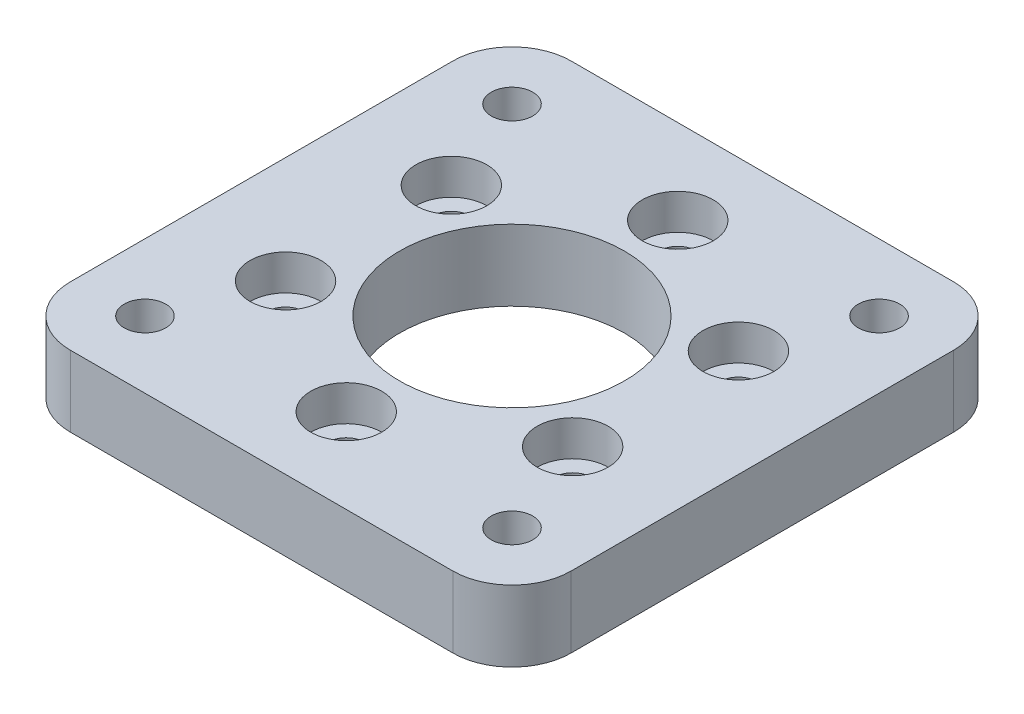
ISO-10303-21;
HEADER;
FILE_DESCRIPTION(('STEP AP214'),'2;1');
FILE_NAME('part.step','',(''),(''),'','','');
FILE_SCHEMA(('AUTOMOTIVE_DESIGN { 1 0 10303 214 1 1 1 1 }'));
ENDSEC;
DATA;
#1=APPLICATION_CONTEXT('core data for automotive mechanical design processes');
#2=APPLICATION_PROTOCOL_DEFINITION('international standard','automotive_design',2000,#1);
#3=PRODUCT_CONTEXT('',#1,'mechanical');
#4=PRODUCT('Part','Part','',(#3));
#5=PRODUCT_RELATED_PRODUCT_CATEGORY('part','',(#4));
#6=PRODUCT_DEFINITION_FORMATION('','',#4);
#7=PRODUCT_DEFINITION_CONTEXT('part definition',#1,'design');
#8=PRODUCT_DEFINITION('design','',#6,#7);
#9=PRODUCT_DEFINITION_SHAPE('','',#8);
#10=(LENGTH_UNIT() NAMED_UNIT(*) SI_UNIT(.MILLI.,.METRE.));
#11=(NAMED_UNIT(*) PLANE_ANGLE_UNIT() SI_UNIT($,.RADIAN.));
#12=(NAMED_UNIT(*) SI_UNIT($,.STERADIAN.) SOLID_ANGLE_UNIT());
#13=UNCERTAINTY_MEASURE_WITH_UNIT(LENGTH_MEASURE(1.E-05),#10,'distance_accuracy_value','');
#14=(GEOMETRIC_REPRESENTATION_CONTEXT(3) GLOBAL_UNCERTAINTY_ASSIGNED_CONTEXT((#13)) GLOBAL_UNIT_ASSIGNED_CONTEXT((#10,
#11,#12)) REPRESENTATION_CONTEXT('',''));
#15=CARTESIAN_POINT('',(0.,0.,0.));
#16=DIRECTION('',(0.,0.,1.));
#17=DIRECTION('',(1.,0.,0.));
#18=AXIS2_PLACEMENT_3D('',#15,#16,#17);
#19=CARTESIAN_POINT('',(-12.1243556529821,-3.,-7.00000000000014));
#20=DIRECTION('',(0.,1.,0.));
#21=DIRECTION('',(0.,0.,1.));
#22=AXIS2_PLACEMENT_3D('',#19,#20,#21);
#23=CYLINDRICAL_SURFACE('',#22,1.55);
#24=CARTESIAN_POINT('',(-12.1243556529821,-3.,-7.00000000000014));
#25=DIRECTION('',(0.,1.,0.));
#26=DIRECTION('',(0.866025403784433,0.,0.50000000000001));
#27=AXIS2_PLACEMENT_3D('',#24,#25,#26);
#28=CIRCLE('',#27,1.55);
#29=CARTESIAN_POINT('',(-10.7820162771162,-3.,-6.22500000000013));
#30=VERTEX_POINT('',#29);
#31=EDGE_CURVE('E167',#30,#30,#28,.T.);
#32=ORIENTED_EDGE('',*,*,#31,.F.);
#33=EDGE_LOOP('',(#32));
#34=FACE_BOUND('',#33,.T.);
#35=CARTESIAN_POINT('',(-12.1243556529821,0.,-7.00000000000014));
#36=DIRECTION('',(0.,1.,0.));
#37=DIRECTION('',(0.,0.,1.));
#38=AXIS2_PLACEMENT_3D('',#35,#36,#37);
#39=CIRCLE('',#38,1.55);
#40=CARTESIAN_POINT('',(-12.1243556529821,0.,-5.45000000000014));
#41=VERTEX_POINT('',#40);
#42=EDGE_CURVE('E39',#41,#41,#39,.F.);
#43=ORIENTED_EDGE('',*,*,#42,.F.);
#44=EDGE_LOOP('',(#43));
#45=FACE_BOUND('',#44,.T.);
#46=ADVANCED_FACE('F35',(#34,#45),#23,.F.);
#47=CARTESIAN_POINT('',(-12.1243556529822,-3.,6.99999999999989));
#48=DIRECTION('',(0.,1.,0.));
#49=DIRECTION('',(0.,0.,1.));
#50=AXIS2_PLACEMENT_3D('',#47,#48,#49);
#51=CYLINDRICAL_SURFACE('',#50,1.55);
#52=CARTESIAN_POINT('',(-12.1243556529822,-3.,6.99999999999989));
#53=DIRECTION('',(0.,1.,0.));
#54=DIRECTION('',(0.866025403784443,0.,-0.499999999999992));
#55=AXIS2_PLACEMENT_3D('',#52,#53,#54);
#56=CIRCLE('',#55,1.55);
#57=CARTESIAN_POINT('',(-10.7820162771163,-3.,6.2249999999999));
#58=VERTEX_POINT('',#57);
#59=EDGE_CURVE('E209',#58,#58,#56,.T.);
#60=ORIENTED_EDGE('',*,*,#59,.F.);
#61=EDGE_LOOP('',(#60));
#62=FACE_BOUND('',#61,.T.);
#63=CARTESIAN_POINT('',(-12.1243556529822,0.,6.99999999999989));
#64=DIRECTION('',(0.,1.,0.));
#65=DIRECTION('',(0.,0.,1.));
#66=AXIS2_PLACEMENT_3D('',#63,#64,#65);
#67=CIRCLE('',#66,1.55);
#68=CARTESIAN_POINT('',(-12.1243556529822,0.,8.54999999999989));
#69=VERTEX_POINT('',#68);
#70=EDGE_CURVE('E178',#69,#69,#67,.F.);
#71=ORIENTED_EDGE('',*,*,#70,.F.);
#72=EDGE_LOOP('',(#71));
#73=FACE_BOUND('',#72,.T.);
#74=ADVANCED_FACE('F286',(#62,#73),#51,.F.);
#75=CARTESIAN_POINT('',(0.,-3.,14.));
#76=DIRECTION('',(0.,1.,0.));
#77=DIRECTION('',(0.,0.,1.));
#78=AXIS2_PLACEMENT_3D('',#75,#76,#77);
#79=CYLINDRICAL_SURFACE('',#78,1.55);
#80=CARTESIAN_POINT('',(0.,-3.,14.));
#81=DIRECTION('',(0.,1.,0.));
#82=DIRECTION('',(0.,0.,-1.));
#83=AXIS2_PLACEMENT_3D('',#80,#81,#82);
#84=CIRCLE('',#83,1.55);
#85=CARTESIAN_POINT('',(0.,-3.,12.45));
#86=VERTEX_POINT('',#85);
#87=EDGE_CURVE('E212',#86,#86,#84,.T.);
#88=ORIENTED_EDGE('',*,*,#87,.F.);
#89=EDGE_LOOP('',(#88));
#90=FACE_BOUND('',#89,.T.);
#91=CARTESIAN_POINT('',(0.,0.,14.));
#92=DIRECTION('',(0.,1.,0.));
#93=DIRECTION('',(0.,0.,1.));
#94=AXIS2_PLACEMENT_3D('',#91,#92,#93);
#95=CIRCLE('',#94,1.55);
#96=CARTESIAN_POINT('',(0.,0.,15.55));
#97=VERTEX_POINT('',#96);
#98=EDGE_CURVE('E174',#97,#97,#95,.F.);
#99=ORIENTED_EDGE('',*,*,#98,.F.);
#100=EDGE_LOOP('',(#99));
#101=FACE_BOUND('',#100,.T.);
#102=ADVANCED_FACE('F292',(#90,#101),#79,.F.);
#103=CARTESIAN_POINT('',(12.1243556529821,-3.,7.00000000000006));
#104=DIRECTION('',(0.,1.,0.));
#105=DIRECTION('',(0.,0.,1.));
#106=AXIS2_PLACEMENT_3D('',#103,#104,#105);
#107=CYLINDRICAL_SURFACE('',#106,1.55);
#108=CARTESIAN_POINT('',(12.1243556529821,-3.,7.00000000000006));
#109=DIRECTION('',(0.,1.,0.));
#110=DIRECTION('',(-0.866025403784436,0.,-0.500000000000004));
#111=AXIS2_PLACEMENT_3D('',#108,#109,#110);
#112=CIRCLE('',#111,1.55);
#113=CARTESIAN_POINT('',(10.7820162771162,-3.,6.22500000000005));
#114=VERTEX_POINT('',#113);
#115=EDGE_CURVE('E215',#114,#114,#112,.T.);
#116=ORIENTED_EDGE('',*,*,#115,.F.);
#117=EDGE_LOOP('',(#116));
#118=FACE_BOUND('',#117,.T.);
#119=CARTESIAN_POINT('',(12.1243556529821,0.,7.00000000000006));
#120=DIRECTION('',(0.,1.,0.));
#121=DIRECTION('',(0.,0.,1.));
#122=AXIS2_PLACEMENT_3D('',#119,#120,#121);
#123=CIRCLE('',#122,1.55);
#124=CARTESIAN_POINT('',(12.1243556529821,0.,8.55000000000006));
#125=VERTEX_POINT('',#124);
#126=EDGE_CURVE('E169',#125,#125,#123,.F.);
#127=ORIENTED_EDGE('',*,*,#126,.F.);
#128=EDGE_LOOP('',(#127));
#129=FACE_BOUND('',#128,.T.);
#130=ADVANCED_FACE('F303',(#118,#129),#107,.F.);
#131=CARTESIAN_POINT('',(12.1243556529822,-3.,-6.99999999999997));
#132=DIRECTION('',(0.,1.,0.));
#133=DIRECTION('',(0.,0.,1.));
#134=AXIS2_PLACEMENT_3D('',#131,#132,#133);
#135=CYLINDRICAL_SURFACE('',#134,1.55);
#136=CARTESIAN_POINT('',(12.1243556529822,-3.,-6.99999999999997));
#137=DIRECTION('',(0.,1.,0.));
#138=DIRECTION('',(-0.86602540378444,0.,0.499999999999998));
#139=AXIS2_PLACEMENT_3D('',#136,#137,#138);
#140=CIRCLE('',#139,1.55);
#141=CARTESIAN_POINT('',(10.7820162771163,-3.,-6.22499999999998));
#142=VERTEX_POINT('',#141);
#143=EDGE_CURVE('E218',#142,#142,#140,.T.);
#144=ORIENTED_EDGE('',*,*,#143,.F.);
#145=EDGE_LOOP('',(#144));
#146=FACE_BOUND('',#145,.T.);
#147=CARTESIAN_POINT('',(12.1243556529822,0.,-6.99999999999997));
#148=DIRECTION('',(0.,1.,0.));
#149=DIRECTION('',(0.,0.,1.));
#150=AXIS2_PLACEMENT_3D('',#147,#148,#149);
#151=CIRCLE('',#150,1.55);
#152=CARTESIAN_POINT('',(12.1243556529822,0.,-5.44999999999997));
#153=VERTEX_POINT('',#152);
#154=EDGE_CURVE('E164',#153,#153,#151,.F.);
#155=ORIENTED_EDGE('',*,*,#154,.F.);
#156=EDGE_LOOP('',(#155));
#157=FACE_BOUND('',#156,.T.);
#158=ADVANCED_FACE('F307',(#146,#157),#135,.F.);
#159=CARTESIAN_POINT('',(0.,-3.,-14.));
#160=DIRECTION('',(0.,1.,0.));
#161=DIRECTION('',(0.,0.,1.));
#162=AXIS2_PLACEMENT_3D('',#159,#160,#161);
#163=CYLINDRICAL_SURFACE('',#162,1.55);
#164=CARTESIAN_POINT('',(0.,-3.,-14.));
#165=DIRECTION('',(0.,1.,0.));
#166=DIRECTION('',(0.,0.,1.));
#167=AXIS2_PLACEMENT_3D('',#164,#165,#166);
#168=CIRCLE('',#167,1.55);
#169=CARTESIAN_POINT('',(0.,-3.,-12.45));
#170=VERTEX_POINT('',#169);
#171=EDGE_CURVE('E162',#170,#170,#168,.T.);
#172=ORIENTED_EDGE('',*,*,#171,.F.);
#173=EDGE_LOOP('',(#172));
#174=FACE_BOUND('',#173,.T.);
#175=CARTESIAN_POINT('',(0.,0.,-14.));
#176=DIRECTION('',(0.,1.,0.));
#177=DIRECTION('',(0.,0.,1.));
#178=AXIS2_PLACEMENT_3D('',#175,#176,#177);
#179=CIRCLE('',#178,1.55);
#180=CARTESIAN_POINT('',(0.,0.,-12.45));
#181=VERTEX_POINT('',#180);
#182=EDGE_CURVE('E159',#181,#181,#179,.F.);
#183=ORIENTED_EDGE('',*,*,#182,.F.);
#184=EDGE_LOOP('',(#183));
#185=FACE_BOUND('',#184,.T.);
#186=ADVANCED_FACE('F311',(#174,#185),#163,.F.);
#187=CARTESIAN_POINT('',(21.15,3.,-21.15));
#188=DIRECTION('',(-1.,0.,0.));
#189=DIRECTION('',(0.,0.,1.));
#190=AXIS2_PLACEMENT_3D('',#187,#188,#189);
#191=PLANE('',#190);
#192=DIRECTION('',(0.,0.,-1.));
#193=VECTOR('',#192,1.);
#194=CARTESIAN_POINT('',(21.15,-3.,-21.15));
#195=LINE('',#194,#193);
#196=CARTESIAN_POINT('',(21.15,-3.,16.15));
#197=VERTEX_POINT('',#196);
#198=CARTESIAN_POINT('',(21.15,-3.,-16.15));
#199=VERTEX_POINT('',#198);
#200=EDGE_CURVE('E256',#197,#199,#195,.T.);
#201=ORIENTED_EDGE('',*,*,#200,.T.);
#202=DIRECTION('',(0.,-1.,0.));
#203=VECTOR('',#202,1.);
#204=CARTESIAN_POINT('',(21.15,3.,-16.15));
#205=LINE('',#204,#203);
#206=CARTESIAN_POINT('',(21.15,3.,-16.15));
#207=VERTEX_POINT('',#206);
#208=EDGE_CURVE('E11',#199,#207,#205,.F.);
#209=ORIENTED_EDGE('',*,*,#208,.T.);
#210=DIRECTION('',(0.,0.,-1.));
#211=VECTOR('',#210,1.);
#212=CARTESIAN_POINT('',(21.15,3.,-21.15));
#213=LINE('',#212,#211);
#214=CARTESIAN_POINT('',(21.15,3.,16.15));
#215=VERTEX_POINT('',#214);
#216=EDGE_CURVE('E129',#215,#207,#213,.T.);
#217=ORIENTED_EDGE('',*,*,#216,.F.);
#218=DIRECTION('',(0.,-1.,0.));
#219=VECTOR('',#218,1.);
#220=CARTESIAN_POINT('',(21.15,3.,16.15));
#221=LINE('',#220,#219);
#222=EDGE_CURVE('E44',#215,#197,#221,.T.);
#223=ORIENTED_EDGE('',*,*,#222,.T.);
#224=EDGE_LOOP('',(#201,#209,#217,#223));
#225=FACE_BOUND('',#224,.T.);
#226=ADVANCED_FACE('F283',(#225),#191,.F.);
#227=CARTESIAN_POINT('',(-21.15,3.,-21.15));
#228=DIRECTION('',(0.,0.,1.));
#229=DIRECTION('',(1.,0.,0.));
#230=AXIS2_PLACEMENT_3D('',#227,#228,#229);
#231=PLANE('',#230);
#232=DIRECTION('',(-1.,0.,0.));
#233=VECTOR('',#232,1.);
#234=CARTESIAN_POINT('',(-21.15,-3.,-21.15));
#235=LINE('',#234,#233);
#236=CARTESIAN_POINT('',(16.15,-3.,-21.15));
#237=VERTEX_POINT('',#236);
#238=CARTESIAN_POINT('',(-16.15,-3.,-21.15));
#239=VERTEX_POINT('',#238);
#240=EDGE_CURVE('E134',#237,#239,#235,.T.);
#241=ORIENTED_EDGE('',*,*,#240,.T.);
#242=DIRECTION('',(0.,-1.,0.));
#243=VECTOR('',#242,1.);
#244=CARTESIAN_POINT('',(-16.15,3.,-21.15));
#245=LINE('',#244,#243);
#246=CARTESIAN_POINT('',(-16.15,3.,-21.15));
#247=VERTEX_POINT('',#246);
#248=EDGE_CURVE('E52',#239,#247,#245,.F.);
#249=ORIENTED_EDGE('',*,*,#248,.T.);
#250=DIRECTION('',(-1.,0.,0.));
#251=VECTOR('',#250,1.);
#252=CARTESIAN_POINT('',(-21.15,3.,-21.15));
#253=LINE('',#252,#251);
#254=CARTESIAN_POINT('',(16.15,3.,-21.15));
#255=VERTEX_POINT('',#254);
#256=EDGE_CURVE('E132',#255,#247,#253,.T.);
#257=ORIENTED_EDGE('',*,*,#256,.F.);
#258=DIRECTION('',(0.,-1.,0.));
#259=VECTOR('',#258,1.);
#260=CARTESIAN_POINT('',(16.15,3.,-21.15));
#261=LINE('',#260,#259);
#262=EDGE_CURVE('E153',#255,#237,#261,.T.);
#263=ORIENTED_EDGE('',*,*,#262,.T.);
#264=EDGE_LOOP('',(#241,#249,#257,#263));
#265=FACE_BOUND('',#264,.T.);
#266=ADVANCED_FACE('F266',(#265),#231,.F.);
#267=CARTESIAN_POINT('',(-21.15,3.,-21.15));
#268=DIRECTION('',(1.,0.,0.));
#269=DIRECTION('',(0.,0.,-1.));
#270=AXIS2_PLACEMENT_3D('',#267,#268,#269);
#271=PLANE('',#270);
#272=DIRECTION('',(0.,0.,1.));
#273=VECTOR('',#272,1.);
#274=CARTESIAN_POINT('',(-21.15,-3.,-21.15));
#275=LINE('',#274,#273);
#276=CARTESIAN_POINT('',(-21.15,-3.,-16.15));
#277=VERTEX_POINT('',#276);
#278=CARTESIAN_POINT('',(-21.15,-3.,16.15));
#279=VERTEX_POINT('',#278);
#280=EDGE_CURVE('E130',#277,#279,#275,.T.);
#281=ORIENTED_EDGE('',*,*,#280,.T.);
#282=DIRECTION('',(0.,-1.,0.));
#283=VECTOR('',#282,1.);
#284=CARTESIAN_POINT('',(-21.15,3.,16.15));
#285=LINE('',#284,#283);
#286=CARTESIAN_POINT('',(-21.15,3.,16.15));
#287=VERTEX_POINT('',#286);
#288=EDGE_CURVE('E108',#279,#287,#285,.F.);
#289=ORIENTED_EDGE('',*,*,#288,.T.);
#290=DIRECTION('',(0.,0.,1.));
#291=VECTOR('',#290,1.);
#292=CARTESIAN_POINT('',(-21.15,3.,-21.15));
#293=LINE('',#292,#291);
#294=CARTESIAN_POINT('',(-21.15,3.,-16.15));
#295=VERTEX_POINT('',#294);
#296=EDGE_CURVE('E260',#295,#287,#293,.T.);
#297=ORIENTED_EDGE('',*,*,#296,.F.);
#298=DIRECTION('',(0.,-1.,0.));
#299=VECTOR('',#298,1.);
#300=CARTESIAN_POINT('',(-21.15,3.,-16.15));
#301=LINE('',#300,#299);
#302=EDGE_CURVE('E113',#295,#277,#301,.T.);
#303=ORIENTED_EDGE('',*,*,#302,.T.);
#304=EDGE_LOOP('',(#281,#289,#297,#303));
#305=FACE_BOUND('',#304,.T.);
#306=ADVANCED_FACE('F275',(#305),#271,.F.);
#307=CARTESIAN_POINT('',(-21.15,3.,21.15));
#308=DIRECTION('',(0.,0.,-1.));
#309=DIRECTION('',(-1.,0.,0.));
#310=AXIS2_PLACEMENT_3D('',#307,#308,#309);
#311=PLANE('',#310);
#312=DIRECTION('',(1.,0.,0.));
#313=VECTOR('',#312,1.);
#314=CARTESIAN_POINT('',(-21.15,3.,21.15));
#315=LINE('',#314,#313);
#316=CARTESIAN_POINT('',(-16.15,3.,21.15));
#317=VERTEX_POINT('',#316);
#318=CARTESIAN_POINT('',(16.15,3.,21.15));
#319=VERTEX_POINT('',#318);
#320=EDGE_CURVE('E123',#317,#319,#315,.T.);
#321=ORIENTED_EDGE('',*,*,#320,.F.);
#322=DIRECTION('',(0.,-1.,0.));
#323=VECTOR('',#322,1.);
#324=CARTESIAN_POINT('',(-16.15,3.,21.15));
#325=LINE('',#324,#323);
#326=CARTESIAN_POINT('',(-16.15,-3.,21.15));
#327=VERTEX_POINT('',#326);
#328=EDGE_CURVE('E107',#317,#327,#325,.T.);
#329=ORIENTED_EDGE('',*,*,#328,.T.);
#330=DIRECTION('',(1.,0.,0.));
#331=VECTOR('',#330,1.);
#332=CARTESIAN_POINT('',(-21.15,-3.,21.15));
#333=LINE('',#332,#331);
#334=CARTESIAN_POINT('',(16.15,-3.,21.15));
#335=VERTEX_POINT('',#334);
#336=EDGE_CURVE('E120',#327,#335,#333,.T.);
#337=ORIENTED_EDGE('',*,*,#336,.T.);
#338=DIRECTION('',(0.,-1.,0.));
#339=VECTOR('',#338,1.);
#340=CARTESIAN_POINT('',(16.15,3.,21.15));
#341=LINE('',#340,#339);
#342=EDGE_CURVE('E125',#335,#319,#341,.F.);
#343=ORIENTED_EDGE('',*,*,#342,.T.);
#344=EDGE_LOOP('',(#321,#329,#337,#343));
#345=FACE_BOUND('',#344,.T.);
#346=ADVANCED_FACE('F119',(#345),#311,.F.);
#347=CARTESIAN_POINT('',(0.,3.,0.));
#348=DIRECTION('',(0.,1.,0.));
#349=DIRECTION('',(0.,0.,1.));
#350=AXIS2_PLACEMENT_3D('',#347,#348,#349);
#351=PLANE('',#350);
#352=CARTESIAN_POINT('',(-12.1243556529821,3.,-7.00000000000014));
#353=DIRECTION('',(0.,1.,0.));
#354=DIRECTION('',(0.866025403784433,0.,0.50000000000001));
#355=AXIS2_PLACEMENT_3D('',#352,#353,#354);
#356=CIRCLE('',#355,3.);
#357=CARTESIAN_POINT('',(-9.52627944162876,3.,-5.50000000000011));
#358=VERTEX_POINT('',#357);
#359=EDGE_CURVE('E194',#358,#358,#356,.T.);
#360=ORIENTED_EDGE('',*,*,#359,.F.);
#361=EDGE_LOOP('',(#360));
#362=FACE_BOUND('',#361,.T.);
#363=CARTESIAN_POINT('',(-12.1243556529822,3.,6.99999999999989));
#364=DIRECTION('',(0.,1.,0.));
#365=DIRECTION('',(0.866025403784443,0.,-0.499999999999992));
#366=AXIS2_PLACEMENT_3D('',#363,#364,#365);
#367=CIRCLE('',#366,3.);
#368=CARTESIAN_POINT('',(-9.52627944162888,3.,5.49999999999991));
#369=VERTEX_POINT('',#368);
#370=EDGE_CURVE('E187',#369,#369,#367,.T.);
#371=ORIENTED_EDGE('',*,*,#370,.F.);
#372=EDGE_LOOP('',(#371));
#373=FACE_BOUND('',#372,.T.);
#374=CARTESIAN_POINT('',(0.,3.,14.));
#375=DIRECTION('',(0.,1.,0.));
#376=DIRECTION('',(0.,0.,-1.));
#377=AXIS2_PLACEMENT_3D('',#374,#375,#376);
#378=CIRCLE('',#377,3.);
#379=CARTESIAN_POINT('',(0.,3.,11.));
#380=VERTEX_POINT('',#379);
#381=EDGE_CURVE('E180',#380,#380,#378,.T.);
#382=ORIENTED_EDGE('',*,*,#381,.F.);
#383=EDGE_LOOP('',(#382));
#384=FACE_BOUND('',#383,.T.);
#385=CARTESIAN_POINT('',(12.1243556529821,3.,7.00000000000006));
#386=DIRECTION('',(0.,1.,0.));
#387=DIRECTION('',(-0.866025403784436,0.,-0.500000000000004));
#388=AXIS2_PLACEMENT_3D('',#385,#386,#387);
#389=CIRCLE('',#388,3.);
#390=CARTESIAN_POINT('',(9.5262794416288,3.,5.50000000000004));
#391=VERTEX_POINT('',#390);
#392=EDGE_CURVE('E176',#391,#391,#389,.T.);
#393=ORIENTED_EDGE('',*,*,#392,.F.);
#394=EDGE_LOOP('',(#393));
#395=FACE_BOUND('',#394,.T.);
#396=CARTESIAN_POINT('',(12.1243556529822,3.,-6.99999999999997));
#397=DIRECTION('',(0.,1.,0.));
#398=DIRECTION('',(-0.86602540378444,0.,0.499999999999998));
#399=AXIS2_PLACEMENT_3D('',#396,#397,#398);
#400=CIRCLE('',#399,3.);
#401=CARTESIAN_POINT('',(9.52627944162884,3.,-5.49999999999998));
#402=VERTEX_POINT('',#401);
#403=EDGE_CURVE('E172',#402,#402,#400,.T.);
#404=ORIENTED_EDGE('',*,*,#403,.F.);
#405=EDGE_LOOP('',(#404));
#406=FACE_BOUND('',#405,.T.);
#407=CARTESIAN_POINT('',(0.,3.,-14.));
#408=DIRECTION('',(0.,1.,0.));
#409=DIRECTION('',(0.,0.,1.));
#410=AXIS2_PLACEMENT_3D('',#407,#408,#409);
#411=CIRCLE('',#410,3.);
#412=CARTESIAN_POINT('',(0.,3.,-11.));
#413=VERTEX_POINT('',#412);
#414=EDGE_CURVE('E221',#413,#413,#411,.T.);
#415=ORIENTED_EDGE('',*,*,#414,.F.);
#416=EDGE_LOOP('',(#415));
#417=FACE_BOUND('',#416,.T.);
#418=CARTESIAN_POINT('',(0.,3.,0.));
#419=DIRECTION('',(0.,-1.,0.));
#420=DIRECTION('',(0.,0.,-1.));
#421=AXIS2_PLACEMENT_3D('',#418,#419,#420);
#422=CIRCLE('',#421,9.5);
#423=CARTESIAN_POINT('',(0.,3.,-9.5));
#424=VERTEX_POINT('',#423);
#425=EDGE_CURVE('E229',#424,#424,#422,.T.);
#426=ORIENTED_EDGE('',*,*,#425,.T.);
#427=EDGE_LOOP('',(#426));
#428=FACE_BOUND('',#427,.T.);
#429=CARTESIAN_POINT('',(-15.5,3.,-15.5));
#430=DIRECTION('',(0.,-1.,0.));
#431=DIRECTION('',(0.,0.,-1.));
#432=AXIS2_PLACEMENT_3D('',#429,#430,#431);
#433=CIRCLE('',#432,1.75);
#434=CARTESIAN_POINT('',(-15.5,3.,-17.25));
#435=VERTEX_POINT('',#434);
#436=EDGE_CURVE('E235',#435,#435,#433,.T.);
#437=ORIENTED_EDGE('',*,*,#436,.T.);
#438=EDGE_LOOP('',(#437));
#439=FACE_BOUND('',#438,.T.);
#440=CARTESIAN_POINT('',(15.5,3.,-15.5));
#441=DIRECTION('',(0.,-1.,0.));
#442=DIRECTION('',(0.,0.,-1.));
#443=AXIS2_PLACEMENT_3D('',#440,#441,#442);
#444=CIRCLE('',#443,1.75);
#445=CARTESIAN_POINT('',(15.5,3.,-17.25));
#446=VERTEX_POINT('',#445);
#447=EDGE_CURVE('E241',#446,#446,#444,.T.);
#448=ORIENTED_EDGE('',*,*,#447,.T.);
#449=EDGE_LOOP('',(#448));
#450=FACE_BOUND('',#449,.T.);
#451=CARTESIAN_POINT('',(15.5,3.,15.5));
#452=DIRECTION('',(0.,-1.,0.));
#453=DIRECTION('',(0.,0.,-1.));
#454=AXIS2_PLACEMENT_3D('',#451,#452,#453);
#455=CIRCLE('',#454,1.75);
#456=CARTESIAN_POINT('',(15.5,3.,13.75));
#457=VERTEX_POINT('',#456);
#458=EDGE_CURVE('E247',#457,#457,#455,.T.);
#459=ORIENTED_EDGE('',*,*,#458,.T.);
#460=EDGE_LOOP('',(#459));
#461=FACE_BOUND('',#460,.T.);
#462=CARTESIAN_POINT('',(-15.5,3.,15.5));
#463=DIRECTION('',(0.,-1.,0.));
#464=DIRECTION('',(0.,0.,-1.));
#465=AXIS2_PLACEMENT_3D('',#462,#463,#464);
#466=CIRCLE('',#465,1.75);
#467=CARTESIAN_POINT('',(-15.5,3.,13.75));
#468=VERTEX_POINT('',#467);
#469=EDGE_CURVE('E253',#468,#468,#466,.T.);
#470=ORIENTED_EDGE('',*,*,#469,.T.);
#471=EDGE_LOOP('',(#470));
#472=FACE_BOUND('',#471,.T.);
#473=ORIENTED_EDGE('',*,*,#296,.T.);
#474=CARTESIAN_POINT('',(-16.15,3.,16.15));
#475=DIRECTION('',(0.,1.,0.));
#476=DIRECTION('',(0.,0.,1.));
#477=AXIS2_PLACEMENT_3D('',#474,#475,#476);
#478=CIRCLE('',#477,5.);
#479=EDGE_CURVE('E151',#287,#317,#478,.T.);
#480=ORIENTED_EDGE('',*,*,#479,.T.);
#481=ORIENTED_EDGE('',*,*,#320,.T.);
#482=CARTESIAN_POINT('',(16.15,3.,16.15));
#483=DIRECTION('',(0.,1.,0.));
#484=DIRECTION('',(0.,0.,1.));
#485=AXIS2_PLACEMENT_3D('',#482,#483,#484);
#486=CIRCLE('',#485,5.);
#487=EDGE_CURVE('E146',#319,#215,#486,.T.);
#488=ORIENTED_EDGE('',*,*,#487,.T.);
#489=ORIENTED_EDGE('',*,*,#216,.T.);
#490=CARTESIAN_POINT('',(16.15,3.,-16.15));
#491=DIRECTION('',(0.,1.,0.));
#492=DIRECTION('',(0.,0.,1.));
#493=AXIS2_PLACEMENT_3D('',#490,#491,#492);
#494=CIRCLE('',#493,5.);
#495=EDGE_CURVE('E59',#207,#255,#494,.T.);
#496=ORIENTED_EDGE('',*,*,#495,.T.);
#497=ORIENTED_EDGE('',*,*,#256,.T.);
#498=CARTESIAN_POINT('',(-16.15,3.,-16.15));
#499=DIRECTION('',(0.,1.,0.));
#500=DIRECTION('',(0.,0.,1.));
#501=AXIS2_PLACEMENT_3D('',#498,#499,#500);
#502=CIRCLE('',#501,5.);
#503=EDGE_CURVE('E149',#247,#295,#502,.T.);
#504=ORIENTED_EDGE('',*,*,#503,.T.);
#505=EDGE_LOOP('',(#473,#480,#481,#488,#489,#496,#497,#504));
#506=FACE_BOUND('',#505,.T.);
#507=ADVANCED_FACE('F273',(#362,#373,#384,#395,#406,#417,#428,#439,#450,#461,#472,#506),#351,.T.);
#508=CARTESIAN_POINT('',(0.,-3.,0.));
#509=DIRECTION('',(0.,1.,0.));
#510=DIRECTION('',(0.,0.,1.));
#511=AXIS2_PLACEMENT_3D('',#508,#509,#510);
#512=PLANE('',#511);
#513=ORIENTED_EDGE('',*,*,#31,.T.);
#514=EDGE_LOOP('',(#513));
#515=FACE_BOUND('',#514,.T.);
#516=ORIENTED_EDGE('',*,*,#59,.T.);
#517=EDGE_LOOP('',(#516));
#518=FACE_BOUND('',#517,.T.);
#519=ORIENTED_EDGE('',*,*,#87,.T.);
#520=EDGE_LOOP('',(#519));
#521=FACE_BOUND('',#520,.T.);
#522=ORIENTED_EDGE('',*,*,#115,.T.);
#523=EDGE_LOOP('',(#522));
#524=FACE_BOUND('',#523,.T.);
#525=ORIENTED_EDGE('',*,*,#143,.T.);
#526=EDGE_LOOP('',(#525));
#527=FACE_BOUND('',#526,.T.);
#528=ORIENTED_EDGE('',*,*,#171,.T.);
#529=EDGE_LOOP('',(#528));
#530=FACE_BOUND('',#529,.T.);
#531=CARTESIAN_POINT('',(0.,-3.,0.));
#532=DIRECTION('',(0.,-1.,0.));
#533=DIRECTION('',(0.,0.,-1.));
#534=AXIS2_PLACEMENT_3D('',#531,#532,#533);
#535=CIRCLE('',#534,9.5);
#536=CARTESIAN_POINT('',(0.,-3.,-9.5));
#537=VERTEX_POINT('',#536);
#538=EDGE_CURVE('E228',#537,#537,#535,.T.);
#539=ORIENTED_EDGE('',*,*,#538,.F.);
#540=EDGE_LOOP('',(#539));
#541=FACE_BOUND('',#540,.T.);
#542=CARTESIAN_POINT('',(-15.5,-3.,-15.5));
#543=DIRECTION('',(0.,-1.,0.));
#544=DIRECTION('',(0.,0.,-1.));
#545=AXIS2_PLACEMENT_3D('',#542,#543,#544);
#546=CIRCLE('',#545,1.75);
#547=CARTESIAN_POINT('',(-15.5,-3.,-17.25));
#548=VERTEX_POINT('',#547);
#549=EDGE_CURVE('E232',#548,#548,#546,.T.);
#550=ORIENTED_EDGE('',*,*,#549,.F.);
#551=EDGE_LOOP('',(#550));
#552=FACE_BOUND('',#551,.T.);
#553=CARTESIAN_POINT('',(15.5,-3.,-15.5));
#554=DIRECTION('',(0.,-1.,0.));
#555=DIRECTION('',(0.,0.,-1.));
#556=AXIS2_PLACEMENT_3D('',#553,#554,#555);
#557=CIRCLE('',#556,1.75);
#558=CARTESIAN_POINT('',(15.5,-3.,-17.25));
#559=VERTEX_POINT('',#558);
#560=EDGE_CURVE('E238',#559,#559,#557,.T.);
#561=ORIENTED_EDGE('',*,*,#560,.F.);
#562=EDGE_LOOP('',(#561));
#563=FACE_BOUND('',#562,.T.);
#564=CARTESIAN_POINT('',(15.5,-3.,15.5));
#565=DIRECTION('',(0.,-1.,0.));
#566=DIRECTION('',(0.,0.,-1.));
#567=AXIS2_PLACEMENT_3D('',#564,#565,#566);
#568=CIRCLE('',#567,1.75);
#569=CARTESIAN_POINT('',(15.5,-3.,13.75));
#570=VERTEX_POINT('',#569);
#571=EDGE_CURVE('E244',#570,#570,#568,.T.);
#572=ORIENTED_EDGE('',*,*,#571,.F.);
#573=EDGE_LOOP('',(#572));
#574=FACE_BOUND('',#573,.T.);
#575=CARTESIAN_POINT('',(-15.5,-3.,15.5));
#576=DIRECTION('',(0.,-1.,0.));
#577=DIRECTION('',(0.,0.,-1.));
#578=AXIS2_PLACEMENT_3D('',#575,#576,#577);
#579=CIRCLE('',#578,1.75);
#580=CARTESIAN_POINT('',(-15.5,-3.,13.75));
#581=VERTEX_POINT('',#580);
#582=EDGE_CURVE('E250',#581,#581,#579,.T.);
#583=ORIENTED_EDGE('',*,*,#582,.F.);
#584=EDGE_LOOP('',(#583));
#585=FACE_BOUND('',#584,.T.);
#586=ORIENTED_EDGE('',*,*,#336,.F.);
#587=CARTESIAN_POINT('',(-16.15,-3.,16.15));
#588=DIRECTION('',(0.,1.,0.));
#589=DIRECTION('',(0.,0.,1.));
#590=AXIS2_PLACEMENT_3D('',#587,#588,#589);
#591=CIRCLE('',#590,5.);
#592=EDGE_CURVE('E103',#327,#279,#591,.F.);
#593=ORIENTED_EDGE('',*,*,#592,.T.);
#594=ORIENTED_EDGE('',*,*,#280,.F.);
#595=CARTESIAN_POINT('',(-16.15,-3.,-16.15));
#596=DIRECTION('',(0.,1.,0.));
#597=DIRECTION('',(0.,0.,1.));
#598=AXIS2_PLACEMENT_3D('',#595,#596,#597);
#599=CIRCLE('',#598,5.);
#600=EDGE_CURVE('E114',#277,#239,#599,.F.);
#601=ORIENTED_EDGE('',*,*,#600,.T.);
#602=ORIENTED_EDGE('',*,*,#240,.F.);
#603=CARTESIAN_POINT('',(16.15,-3.,-16.15));
#604=DIRECTION('',(0.,1.,0.));
#605=DIRECTION('',(0.,0.,1.));
#606=AXIS2_PLACEMENT_3D('',#603,#604,#605);
#607=CIRCLE('',#606,5.);
#608=EDGE_CURVE('E140',#237,#199,#607,.F.);
#609=ORIENTED_EDGE('',*,*,#608,.T.);
#610=ORIENTED_EDGE('',*,*,#200,.F.);
#611=CARTESIAN_POINT('',(16.15,-3.,16.15));
#612=DIRECTION('',(0.,1.,0.));
#613=DIRECTION('',(0.,0.,1.));
#614=AXIS2_PLACEMENT_3D('',#611,#612,#613);
#615=CIRCLE('',#614,5.);
#616=EDGE_CURVE('E124',#197,#335,#615,.F.);
#617=ORIENTED_EDGE('',*,*,#616,.T.);
#618=EDGE_LOOP('',(#586,#593,#594,#601,#602,#609,#610,#617));
#619=FACE_BOUND('',#618,.T.);
#620=ADVANCED_FACE('F127',(#515,#518,#521,#524,#527,#530,#541,#552,#563,#574,#585,#619),#512,.F.);
#621=CARTESIAN_POINT('',(-16.15,3.,16.15));
#622=DIRECTION('',(0.,-1.,0.));
#623=DIRECTION('',(0.,0.,-1.));
#624=AXIS2_PLACEMENT_3D('',#621,#622,#623);
#625=CYLINDRICAL_SURFACE('',#624,5.);
#626=ORIENTED_EDGE('',*,*,#479,.F.);
#627=ORIENTED_EDGE('',*,*,#288,.F.);
#628=ORIENTED_EDGE('',*,*,#592,.F.);
#629=ORIENTED_EDGE('',*,*,#328,.F.);
#630=EDGE_LOOP('',(#626,#627,#628,#629));
#631=FACE_BOUND('',#630,.T.);
#632=ADVANCED_FACE('F106',(#631),#625,.T.);
#633=CARTESIAN_POINT('',(-16.15,3.,-16.15));
#634=DIRECTION('',(0.,-1.,0.));
#635=DIRECTION('',(0.,0.,-1.));
#636=AXIS2_PLACEMENT_3D('',#633,#634,#635);
#637=CYLINDRICAL_SURFACE('',#636,5.);
#638=ORIENTED_EDGE('',*,*,#503,.F.);
#639=ORIENTED_EDGE('',*,*,#248,.F.);
#640=ORIENTED_EDGE('',*,*,#600,.F.);
#641=ORIENTED_EDGE('',*,*,#302,.F.);
#642=EDGE_LOOP('',(#638,#639,#640,#641));
#643=FACE_BOUND('',#642,.T.);
#644=ADVANCED_FACE('F270',(#643),#637,.T.);
#645=CARTESIAN_POINT('',(16.15,3.,-16.15));
#646=DIRECTION('',(0.,-1.,0.));
#647=DIRECTION('',(0.,0.,-1.));
#648=AXIS2_PLACEMENT_3D('',#645,#646,#647);
#649=CYLINDRICAL_SURFACE('',#648,5.);
#650=ORIENTED_EDGE('',*,*,#495,.F.);
#651=ORIENTED_EDGE('',*,*,#208,.F.);
#652=ORIENTED_EDGE('',*,*,#608,.F.);
#653=ORIENTED_EDGE('',*,*,#262,.F.);
#654=EDGE_LOOP('',(#650,#651,#652,#653));
#655=FACE_BOUND('',#654,.T.);
#656=ADVANCED_FACE('F579',(#655),#649,.T.);
#657=CARTESIAN_POINT('',(16.15,3.,16.15));
#658=DIRECTION('',(0.,-1.,0.));
#659=DIRECTION('',(0.,0.,-1.));
#660=AXIS2_PLACEMENT_3D('',#657,#658,#659);
#661=CYLINDRICAL_SURFACE('',#660,5.);
#662=ORIENTED_EDGE('',*,*,#487,.F.);
#663=ORIENTED_EDGE('',*,*,#342,.F.);
#664=ORIENTED_EDGE('',*,*,#616,.F.);
#665=ORIENTED_EDGE('',*,*,#222,.F.);
#666=EDGE_LOOP('',(#662,#663,#664,#665));
#667=FACE_BOUND('',#666,.T.);
#668=ADVANCED_FACE('F37',(#667),#661,.T.);
#669=CARTESIAN_POINT('',(-15.5,3.,15.5));
#670=DIRECTION('',(0.,-1.,0.));
#671=DIRECTION('',(0.,0.,-1.));
#672=AXIS2_PLACEMENT_3D('',#669,#670,#671);
#673=CYLINDRICAL_SURFACE('',#672,1.75);
#674=ORIENTED_EDGE('',*,*,#469,.F.);
#675=EDGE_LOOP('',(#674));
#676=FACE_BOUND('',#675,.T.);
#677=ORIENTED_EDGE('',*,*,#582,.T.);
#678=EDGE_LOOP('',(#677));
#679=FACE_BOUND('',#678,.T.);
#680=ADVANCED_FACE('F340',(#676,#679),#673,.F.);
#681=CARTESIAN_POINT('',(15.5,3.,15.5));
#682=DIRECTION('',(0.,-1.,0.));
#683=DIRECTION('',(0.,0.,-1.));
#684=AXIS2_PLACEMENT_3D('',#681,#682,#683);
#685=CYLINDRICAL_SURFACE('',#684,1.75);
#686=ORIENTED_EDGE('',*,*,#458,.F.);
#687=EDGE_LOOP('',(#686));
#688=FACE_BOUND('',#687,.T.);
#689=ORIENTED_EDGE('',*,*,#571,.T.);
#690=EDGE_LOOP('',(#689));
#691=FACE_BOUND('',#690,.T.);
#692=ADVANCED_FACE('F336',(#688,#691),#685,.F.);
#693=CARTESIAN_POINT('',(15.5,3.,-15.5));
#694=DIRECTION('',(0.,-1.,0.));
#695=DIRECTION('',(0.,0.,-1.));
#696=AXIS2_PLACEMENT_3D('',#693,#694,#695);
#697=CYLINDRICAL_SURFACE('',#696,1.75);
#698=ORIENTED_EDGE('',*,*,#447,.F.);
#699=EDGE_LOOP('',(#698));
#700=FACE_BOUND('',#699,.T.);
#701=ORIENTED_EDGE('',*,*,#560,.T.);
#702=EDGE_LOOP('',(#701));
#703=FACE_BOUND('',#702,.T.);
#704=ADVANCED_FACE('F332',(#700,#703),#697,.F.);
#705=CARTESIAN_POINT('',(-15.5,3.,-15.5));
#706=DIRECTION('',(0.,-1.,0.));
#707=DIRECTION('',(0.,0.,-1.));
#708=AXIS2_PLACEMENT_3D('',#705,#706,#707);
#709=CYLINDRICAL_SURFACE('',#708,1.75);
#710=ORIENTED_EDGE('',*,*,#436,.F.);
#711=EDGE_LOOP('',(#710));
#712=FACE_BOUND('',#711,.T.);
#713=ORIENTED_EDGE('',*,*,#549,.T.);
#714=EDGE_LOOP('',(#713));
#715=FACE_BOUND('',#714,.T.);
#716=ADVANCED_FACE('F328',(#712,#715),#709,.F.);
#717=CARTESIAN_POINT('',(0.,3.,0.));
#718=DIRECTION('',(0.,-1.,0.));
#719=DIRECTION('',(0.,0.,-1.));
#720=AXIS2_PLACEMENT_3D('',#717,#718,#719);
#721=CYLINDRICAL_SURFACE('',#720,9.5);
#722=ORIENTED_EDGE('',*,*,#425,.F.);
#723=EDGE_LOOP('',(#722));
#724=FACE_BOUND('',#723,.T.);
#725=ORIENTED_EDGE('',*,*,#538,.T.);
#726=EDGE_LOOP('',(#725));
#727=FACE_BOUND('',#726,.T.);
#728=ADVANCED_FACE('F317',(#724,#727),#721,.F.);
#729=CARTESIAN_POINT('',(0.,0.,-14.));
#730=DIRECTION('',(0.,1.,0.));
#731=DIRECTION('',(0.,0.,1.));
#732=AXIS2_PLACEMENT_3D('',#729,#730,#731);
#733=PLANE('',#732);
#734=CARTESIAN_POINT('',(0.,0.,-14.));
#735=DIRECTION('',(0.,1.,0.));
#736=DIRECTION('',(0.,0.,1.));
#737=AXIS2_PLACEMENT_3D('',#734,#735,#736);
#738=CIRCLE('',#737,3.);
#739=CARTESIAN_POINT('',(0.,0.,-11.));
#740=VERTEX_POINT('',#739);
#741=EDGE_CURVE('E163',#740,#740,#738,.T.);
#742=ORIENTED_EDGE('',*,*,#741,.T.);
#743=EDGE_LOOP('',(#742));
#744=FACE_BOUND('',#743,.T.);
#745=ORIENTED_EDGE('',*,*,#182,.T.);
#746=EDGE_LOOP('',(#745));
#747=FACE_BOUND('',#746,.T.);
#748=ADVANCED_FACE('F313',(#744,#747),#733,.T.);
#749=CARTESIAN_POINT('',(0.,0.,-14.));
#750=DIRECTION('',(0.,1.,0.));
#751=DIRECTION('',(0.,0.,1.));
#752=AXIS2_PLACEMENT_3D('',#749,#750,#751);
#753=CYLINDRICAL_SURFACE('',#752,3.);
#754=ORIENTED_EDGE('',*,*,#741,.F.);
#755=EDGE_LOOP('',(#754));
#756=FACE_BOUND('',#755,.T.);
#757=ORIENTED_EDGE('',*,*,#414,.T.);
#758=EDGE_LOOP('',(#757));
#759=FACE_BOUND('',#758,.T.);
#760=ADVANCED_FACE('F316',(#756,#759),#753,.F.);
#761=CARTESIAN_POINT('',(12.1243556529822,0.,-6.99999999999997));
#762=DIRECTION('',(0.,1.,0.));
#763=DIRECTION('',(-0.86602540378444,0.,0.499999999999998));
#764=AXIS2_PLACEMENT_3D('',#761,#762,#763);
#765=PLANE('',#764);
#766=CARTESIAN_POINT('',(12.1243556529822,0.,-6.99999999999997));
#767=DIRECTION('',(0.,1.,0.));
#768=DIRECTION('',(-0.86602540378444,0.,0.499999999999998));
#769=AXIS2_PLACEMENT_3D('',#766,#767,#768);
#770=CIRCLE('',#769,3.);
#771=CARTESIAN_POINT('',(9.52627944162884,0.,-5.49999999999998));
#772=VERTEX_POINT('',#771);
#773=EDGE_CURVE('E168',#772,#772,#770,.T.);
#774=ORIENTED_EDGE('',*,*,#773,.T.);
#775=EDGE_LOOP('',(#774));
#776=FACE_BOUND('',#775,.T.);
#777=ORIENTED_EDGE('',*,*,#154,.T.);
#778=EDGE_LOOP('',(#777));
#779=FACE_BOUND('',#778,.T.);
#780=ADVANCED_FACE('F321',(#776,#779),#765,.T.);
#781=CARTESIAN_POINT('',(12.1243556529822,0.,-6.99999999999997));
#782=DIRECTION('',(0.,1.,0.));
#783=DIRECTION('',(0.,0.,1.));
#784=AXIS2_PLACEMENT_3D('',#781,#782,#783);
#785=CYLINDRICAL_SURFACE('',#784,3.);
#786=ORIENTED_EDGE('',*,*,#773,.F.);
#787=EDGE_LOOP('',(#786));
#788=FACE_BOUND('',#787,.T.);
#789=ORIENTED_EDGE('',*,*,#403,.T.);
#790=EDGE_LOOP('',(#789));
#791=FACE_BOUND('',#790,.T.);
#792=ADVANCED_FACE('F298',(#788,#791),#785,.F.);
#793=CARTESIAN_POINT('',(12.1243556529821,0.,7.00000000000006));
#794=DIRECTION('',(0.,1.,0.));
#795=DIRECTION('',(-0.866025403784436,0.,-0.500000000000004));
#796=AXIS2_PLACEMENT_3D('',#793,#794,#795);
#797=PLANE('',#796);
#798=CARTESIAN_POINT('',(12.1243556529821,0.,7.00000000000006));
#799=DIRECTION('',(0.,1.,0.));
#800=DIRECTION('',(-0.866025403784436,0.,-0.500000000000004));
#801=AXIS2_PLACEMENT_3D('',#798,#799,#800);
#802=CIRCLE('',#801,3.);
#803=CARTESIAN_POINT('',(9.5262794416288,0.,5.50000000000004));
#804=VERTEX_POINT('',#803);
#805=EDGE_CURVE('E173',#804,#804,#802,.T.);
#806=ORIENTED_EDGE('',*,*,#805,.T.);
#807=EDGE_LOOP('',(#806));
#808=FACE_BOUND('',#807,.T.);
#809=ORIENTED_EDGE('',*,*,#126,.T.);
#810=EDGE_LOOP('',(#809));
#811=FACE_BOUND('',#810,.T.);
#812=ADVANCED_FACE('F390',(#808,#811),#797,.T.);
#813=CARTESIAN_POINT('',(12.1243556529821,0.,7.00000000000006));
#814=DIRECTION('',(0.,1.,0.));
#815=DIRECTION('',(0.,0.,1.));
#816=AXIS2_PLACEMENT_3D('',#813,#814,#815);
#817=CYLINDRICAL_SURFACE('',#816,3.);
#818=ORIENTED_EDGE('',*,*,#805,.F.);
#819=EDGE_LOOP('',(#818));
#820=FACE_BOUND('',#819,.T.);
#821=ORIENTED_EDGE('',*,*,#392,.T.);
#822=EDGE_LOOP('',(#821));
#823=FACE_BOUND('',#822,.T.);
#824=ADVANCED_FACE('F393',(#820,#823),#817,.F.);
#825=CARTESIAN_POINT('',(0.,0.,14.));
#826=DIRECTION('',(0.,1.,0.));
#827=DIRECTION('',(0.,0.,-1.));
#828=AXIS2_PLACEMENT_3D('',#825,#826,#827);
#829=PLANE('',#828);
#830=CARTESIAN_POINT('',(0.,0.,14.));
#831=DIRECTION('',(0.,1.,0.));
#832=DIRECTION('',(0.,0.,-1.));
#833=AXIS2_PLACEMENT_3D('',#830,#831,#832);
#834=CIRCLE('',#833,3.);
#835=CARTESIAN_POINT('',(0.,0.,11.));
#836=VERTEX_POINT('',#835);
#837=EDGE_CURVE('E177',#836,#836,#834,.T.);
#838=ORIENTED_EDGE('',*,*,#837,.T.);
#839=EDGE_LOOP('',(#838));
#840=FACE_BOUND('',#839,.T.);
#841=ORIENTED_EDGE('',*,*,#98,.T.);
#842=EDGE_LOOP('',(#841));
#843=FACE_BOUND('',#842,.T.);
#844=ADVANCED_FACE('F396',(#840,#843),#829,.T.);
#845=CARTESIAN_POINT('',(0.,0.,14.));
#846=DIRECTION('',(0.,1.,0.));
#847=DIRECTION('',(0.,0.,1.));
#848=AXIS2_PLACEMENT_3D('',#845,#846,#847);
#849=CYLINDRICAL_SURFACE('',#848,3.);
#850=ORIENTED_EDGE('',*,*,#837,.F.);
#851=EDGE_LOOP('',(#850));
#852=FACE_BOUND('',#851,.T.);
#853=ORIENTED_EDGE('',*,*,#381,.T.);
#854=EDGE_LOOP('',(#853));
#855=FACE_BOUND('',#854,.T.);
#856=ADVANCED_FACE('F401',(#852,#855),#849,.F.);
#857=CARTESIAN_POINT('',(-12.1243556529822,0.,6.99999999999989));
#858=DIRECTION('',(0.,1.,0.));
#859=DIRECTION('',(0.866025403784443,0.,-0.499999999999992));
#860=AXIS2_PLACEMENT_3D('',#857,#858,#859);
#861=PLANE('',#860);
#862=CARTESIAN_POINT('',(-12.1243556529822,0.,6.99999999999989));
#863=DIRECTION('',(0.,1.,0.));
#864=DIRECTION('',(0.866025403784443,0.,-0.499999999999992));
#865=AXIS2_PLACEMENT_3D('',#862,#863,#864);
#866=CIRCLE('',#865,3.);
#867=CARTESIAN_POINT('',(-9.52627944162888,0.,5.49999999999991));
#868=VERTEX_POINT('',#867);
#869=EDGE_CURVE('E181',#868,#868,#866,.T.);
#870=ORIENTED_EDGE('',*,*,#869,.T.);
#871=EDGE_LOOP('',(#870));
#872=FACE_BOUND('',#871,.T.);
#873=ORIENTED_EDGE('',*,*,#70,.T.);
#874=EDGE_LOOP('',(#873));
#875=FACE_BOUND('',#874,.T.);
#876=ADVANCED_FACE('F404',(#872,#875),#861,.T.);
#877=CARTESIAN_POINT('',(-12.1243556529822,0.,6.99999999999989));
#878=DIRECTION('',(0.,1.,0.));
#879=DIRECTION('',(0.,0.,1.));
#880=AXIS2_PLACEMENT_3D('',#877,#878,#879);
#881=CYLINDRICAL_SURFACE('',#880,3.);
#882=ORIENTED_EDGE('',*,*,#869,.F.);
#883=EDGE_LOOP('',(#882));
#884=FACE_BOUND('',#883,.T.);
#885=ORIENTED_EDGE('',*,*,#370,.T.);
#886=EDGE_LOOP('',(#885));
#887=FACE_BOUND('',#886,.T.);
#888=ADVANCED_FACE('F409',(#884,#887),#881,.F.);
#889=CARTESIAN_POINT('',(-12.1243556529821,0.,-7.00000000000014));
#890=DIRECTION('',(0.,1.,0.));
#891=DIRECTION('',(0.866025403784433,0.,0.50000000000001));
#892=AXIS2_PLACEMENT_3D('',#889,#890,#891);
#893=PLANE('',#892);
#894=CARTESIAN_POINT('',(-12.1243556529821,0.,-7.00000000000014));
#895=DIRECTION('',(0.,1.,0.));
#896=DIRECTION('',(0.866025403784433,0.,0.50000000000001));
#897=AXIS2_PLACEMENT_3D('',#894,#895,#896);
#898=CIRCLE('',#897,3.);
#899=CARTESIAN_POINT('',(-9.52627944162876,0.,-5.50000000000011));
#900=VERTEX_POINT('',#899);
#901=EDGE_CURVE('E427',#900,#900,#898,.T.);
#902=ORIENTED_EDGE('',*,*,#901,.T.);
#903=EDGE_LOOP('',(#902));
#904=FACE_BOUND('',#903,.T.);
#905=ORIENTED_EDGE('',*,*,#42,.T.);
#906=EDGE_LOOP('',(#905));
#907=FACE_BOUND('',#906,.T.);
#908=ADVANCED_FACE('F412',(#904,#907),#893,.T.);
#909=CARTESIAN_POINT('',(-12.1243556529821,0.,-7.00000000000014));
#910=DIRECTION('',(0.,1.,0.));
#911=DIRECTION('',(0.,0.,1.));
#912=AXIS2_PLACEMENT_3D('',#909,#910,#911);
#913=CYLINDRICAL_SURFACE('',#912,3.);
#914=ORIENTED_EDGE('',*,*,#901,.F.);
#915=EDGE_LOOP('',(#914));
#916=FACE_BOUND('',#915,.T.);
#917=ORIENTED_EDGE('',*,*,#359,.T.);
#918=EDGE_LOOP('',(#917));
#919=FACE_BOUND('',#918,.T.);
#920=ADVANCED_FACE('F416',(#916,#919),#913,.F.);
#921=CLOSED_SHELL('',(#46,#74,#102,#130,#158,#186,#226,#266,#306,#346,#507,#620,#632,#644,#656,
#668,#680,#692,#704,#716,#728,#748,#760,#780,#792,#812,#824,#844,#856,#876,#888,#908,#920));
#922=MANIFOLD_SOLID_BREP('B2',#921);
#923=ADVANCED_BREP_SHAPE_REPRESENTATION('',(#18,#922),#14);
#924=SHAPE_DEFINITION_REPRESENTATION(#9,#923);
ENDSEC;
END-ISO-10303-21;
